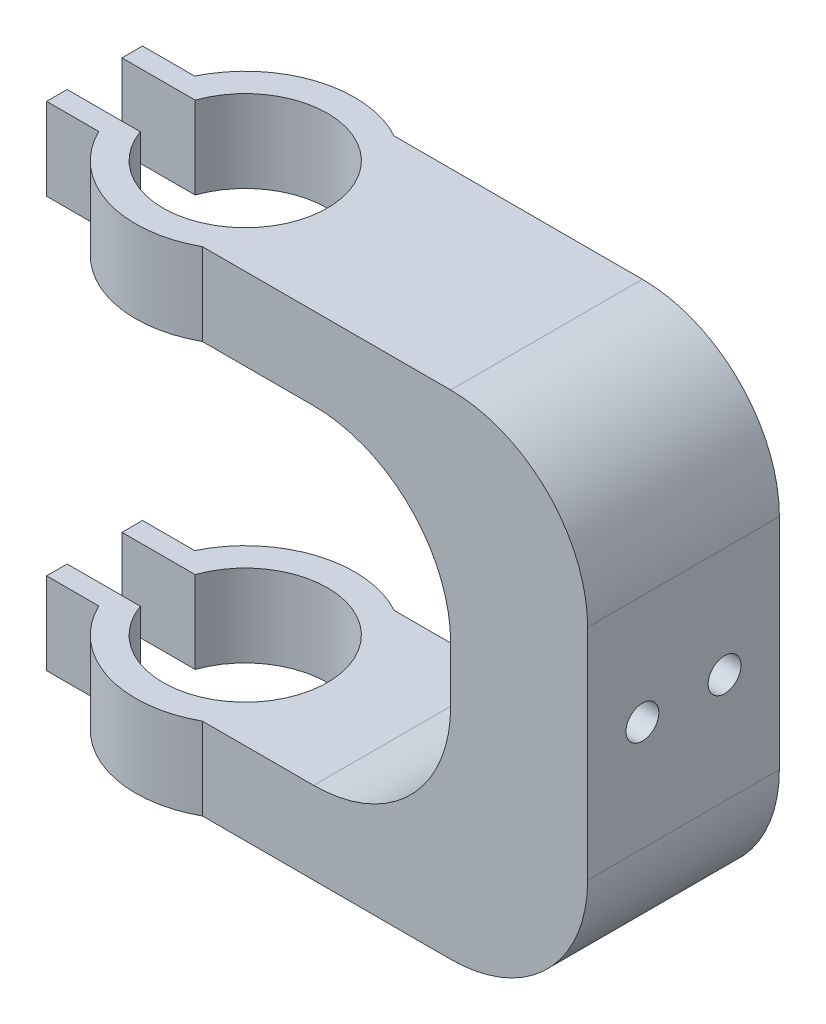
ISO-10303-21;
HEADER;
FILE_DESCRIPTION(('STEP AP214'),'2;1');
FILE_NAME('part.step','',(''),(''),'','','');
FILE_SCHEMA(('AUTOMOTIVE_DESIGN { 1 0 10303 214 1 1 1 1 }'));
ENDSEC;
DATA;
#1=APPLICATION_CONTEXT('core data for automotive mechanical design processes');
#2=APPLICATION_PROTOCOL_DEFINITION('international standard','automotive_design',2000,#1);
#3=PRODUCT_CONTEXT('',#1,'mechanical');
#4=PRODUCT('Part','Part','',(#3));
#5=PRODUCT_RELATED_PRODUCT_CATEGORY('part','',(#4));
#6=PRODUCT_DEFINITION_FORMATION('','',#4);
#7=PRODUCT_DEFINITION_CONTEXT('part definition',#1,'design');
#8=PRODUCT_DEFINITION('design','',#6,#7);
#9=PRODUCT_DEFINITION_SHAPE('','',#8);
#10=(LENGTH_UNIT() NAMED_UNIT(*) SI_UNIT(.MILLI.,.METRE.));
#11=(NAMED_UNIT(*) PLANE_ANGLE_UNIT() SI_UNIT($,.RADIAN.));
#12=(NAMED_UNIT(*) SI_UNIT($,.STERADIAN.) SOLID_ANGLE_UNIT());
#13=UNCERTAINTY_MEASURE_WITH_UNIT(LENGTH_MEASURE(1.E-05),#10,'distance_accuracy_value','');
#14=(GEOMETRIC_REPRESENTATION_CONTEXT(3) GLOBAL_UNCERTAINTY_ASSIGNED_CONTEXT((#13)) GLOBAL_UNIT_ASSIGNED_CONTEXT((#10,
#11,#12)) REPRESENTATION_CONTEXT('',''));
#15=CARTESIAN_POINT('',(0.,0.,0.));
#16=DIRECTION('',(0.,0.,1.));
#17=DIRECTION('',(1.,0.,0.));
#18=AXIS2_PLACEMENT_3D('',#15,#16,#17);
#19=CARTESIAN_POINT('',(-18.6807840209167,-9.,-1.));
#20=DIRECTION('',(0.,0.,-1.));
#21=DIRECTION('',(-1.,0.,0.));
#22=AXIS2_PLACEMENT_3D('',#19,#20,#21);
#23=PLANE('',#22);
#24=DIRECTION('',(0.,1.,0.));
#25=VECTOR('',#24,1.);
#26=CARTESIAN_POINT('',(-19.,-21.4197423483742,-1.));
#27=LINE('',#26,#25);
#28=CARTESIAN_POINT('',(-19.,6.,-1.));
#29=VERTEX_POINT('',#28);
#30=CARTESIAN_POINT('',(-19.,9.,-1.));
#31=VERTEX_POINT('',#30);
#32=EDGE_CURVE('E333',#29,#31,#27,.T.);
#33=ORIENTED_EDGE('',*,*,#32,.F.);
#34=DIRECTION('',(1.,0.,0.));
#35=VECTOR('',#34,1.);
#36=CARTESIAN_POINT('',(-18.6807840209167,6.,-1.));
#37=LINE('',#36,#35);
#38=CARTESIAN_POINT('',(-16.3284271247462,6.,-1.));
#39=VERTEX_POINT('',#38);
#40=EDGE_CURVE('E290',#29,#39,#37,.T.);
#41=ORIENTED_EDGE('',*,*,#40,.T.);
#42=DIRECTION('',(0.,1.,0.));
#43=VECTOR('',#42,1.);
#44=CARTESIAN_POINT('',(-16.3284271247462,-9.00000000000001,-1.));
#45=LINE('',#44,#43);
#46=CARTESIAN_POINT('',(-16.3284271247462,9.,-1.));
#47=VERTEX_POINT('',#46);
#48=EDGE_CURVE('E266',#39,#47,#45,.T.);
#49=ORIENTED_EDGE('',*,*,#48,.T.);
#50=DIRECTION('',(-1.,0.,0.));
#51=VECTOR('',#50,1.);
#52=CARTESIAN_POINT('',(-18.6807840209167,9.,-1.));
#53=LINE('',#52,#51);
#54=EDGE_CURVE('E351',#47,#31,#53,.T.);
#55=ORIENTED_EDGE('',*,*,#54,.T.);
#56=EDGE_LOOP('',(#33,#41,#49,#55));
#57=FACE_BOUND('',#56,.T.);
#58=ADVANCED_FACE('F42',(#57),#23,.F.);
#59=CARTESIAN_POINT('',(-13.5,-9.,0.));
#60=DIRECTION('',(0.,1.,0.));
#61=DIRECTION('',(-1.,0.,0.));
#62=AXIS2_PLACEMENT_3D('',#59,#60,#61);
#63=CYLINDRICAL_SURFACE('',#62,3.);
#64=CARTESIAN_POINT('',(-13.5,6.,0.));
#65=DIRECTION('',(0.,1.,0.));
#66=DIRECTION('',(0.,0.,1.));
#67=AXIS2_PLACEMENT_3D('',#64,#65,#66);
#68=CIRCLE('',#67,3.);
#69=CARTESIAN_POINT('',(-16.3284271247462,6.,1.));
#70=VERTEX_POINT('',#69);
#71=EDGE_CURVE('E304',#39,#70,#68,.F.);
#72=ORIENTED_EDGE('',*,*,#71,.T.);
#73=DIRECTION('',(0.,1.,0.));
#74=VECTOR('',#73,1.);
#75=CARTESIAN_POINT('',(-16.3284271247462,-9.00000000000001,1.));
#76=LINE('',#75,#74);
#77=CARTESIAN_POINT('',(-16.3284271247462,9.,1.));
#78=VERTEX_POINT('',#77);
#79=EDGE_CURVE('E269',#70,#78,#76,.T.);
#80=ORIENTED_EDGE('',*,*,#79,.T.);
#81=CARTESIAN_POINT('',(-13.5,9.,0.));
#82=DIRECTION('',(0.,1.,0.));
#83=DIRECTION('',(-1.,0.,0.));
#84=AXIS2_PLACEMENT_3D('',#81,#82,#83);
#85=CIRCLE('',#84,3.);
#86=EDGE_CURVE('E356',#78,#47,#85,.T.);
#87=ORIENTED_EDGE('',*,*,#86,.T.);
#88=ORIENTED_EDGE('',*,*,#48,.F.);
#89=EDGE_LOOP('',(#72,#80,#87,#88));
#90=FACE_BOUND('',#89,.T.);
#91=ADVANCED_FACE('F477',(#90),#63,.F.);
#92=CARTESIAN_POINT('',(-18.6807840209167,-9.,1.));
#93=DIRECTION('',(0.,0.,1.));
#94=DIRECTION('',(1.,0.,0.));
#95=AXIS2_PLACEMENT_3D('',#92,#93,#94);
#96=PLANE('',#95);
#97=DIRECTION('',(1.,0.,0.));
#98=VECTOR('',#97,1.);
#99=CARTESIAN_POINT('',(-18.6807840209167,9.,1.));
#100=LINE('',#99,#98);
#101=CARTESIAN_POINT('',(-19.,9.,1.));
#102=VERTEX_POINT('',#101);
#103=EDGE_CURVE('E354',#102,#78,#100,.T.);
#104=ORIENTED_EDGE('',*,*,#103,.T.);
#105=ORIENTED_EDGE('',*,*,#79,.F.);
#106=DIRECTION('',(-1.,0.,0.));
#107=VECTOR('',#106,1.);
#108=CARTESIAN_POINT('',(-18.6807840209167,6.,1.));
#109=LINE('',#108,#107);
#110=CARTESIAN_POINT('',(-19.,6.,1.));
#111=VERTEX_POINT('',#110);
#112=EDGE_CURVE('E287',#70,#111,#109,.T.);
#113=ORIENTED_EDGE('',*,*,#112,.T.);
#114=DIRECTION('',(0.,1.,0.));
#115=VECTOR('',#114,1.);
#116=CARTESIAN_POINT('',(-19.,-21.4197423483742,1.));
#117=LINE('',#116,#115);
#118=EDGE_CURVE('E330',#111,#102,#117,.T.);
#119=ORIENTED_EDGE('',*,*,#118,.T.);
#120=EDGE_LOOP('',(#104,#105,#113,#119));
#121=FACE_BOUND('',#120,.T.);
#122=ADVANCED_FACE('F480',(#121),#96,.F.);
#123=CARTESIAN_POINT('',(-17.0968736424845,-21.4197423483742,1.75));
#124=DIRECTION('',(0.,0.,1.));
#125=DIRECTION('',(1.,0.,0.));
#126=AXIS2_PLACEMENT_3D('',#123,#124,#125);
#127=PLANE('',#126);
#128=DIRECTION('',(-1.,0.,0.));
#129=VECTOR('',#128,1.);
#130=CARTESIAN_POINT('',(-17.0968736424845,6.,1.75));
#131=LINE('',#130,#129);
#132=CARTESIAN_POINT('',(-17.0968736424845,6.,1.75));
#133=VERTEX_POINT('',#132);
#134=CARTESIAN_POINT('',(-19.,6.,1.75));
#135=VERTEX_POINT('',#134);
#136=EDGE_CURVE('E299',#133,#135,#131,.T.);
#137=ORIENTED_EDGE('',*,*,#136,.F.);
#138=DIRECTION('',(0.,1.,0.));
#139=VECTOR('',#138,1.);
#140=CARTESIAN_POINT('',(-17.0968736424845,-9.00000000000001,1.75));
#141=LINE('',#140,#139);
#142=CARTESIAN_POINT('',(-17.0968736424845,9.,1.75));
#143=VERTEX_POINT('',#142);
#144=EDGE_CURVE('E262',#133,#143,#141,.T.);
#145=ORIENTED_EDGE('',*,*,#144,.T.);
#146=DIRECTION('',(1.,0.,0.));
#147=VECTOR('',#146,1.);
#148=CARTESIAN_POINT('',(-17.0968736424845,9.,1.75));
#149=LINE('',#148,#147);
#150=CARTESIAN_POINT('',(-19.,9.,1.75));
#151=VERTEX_POINT('',#150);
#152=EDGE_CURVE('E318',#151,#143,#149,.T.);
#153=ORIENTED_EDGE('',*,*,#152,.F.);
#154=DIRECTION('',(0.,1.,0.));
#155=VECTOR('',#154,1.);
#156=CARTESIAN_POINT('',(-19.,-21.4197423483742,1.75));
#157=LINE('',#156,#155);
#158=EDGE_CURVE('E340',#135,#151,#157,.T.);
#159=ORIENTED_EDGE('',*,*,#158,.F.);
#160=EDGE_LOOP('',(#137,#145,#153,#159));
#161=FACE_BOUND('',#160,.T.);
#162=ADVANCED_FACE('F491',(#161),#127,.T.);
#163=CARTESIAN_POINT('',(-17.0968736424845,-21.4197423483742,-1.75));
#164=DIRECTION('',(0.,0.,-1.));
#165=DIRECTION('',(-1.,0.,0.));
#166=AXIS2_PLACEMENT_3D('',#163,#164,#165);
#167=PLANE('',#166);
#168=DIRECTION('',(1.,0.,0.));
#169=VECTOR('',#168,1.);
#170=CARTESIAN_POINT('',(-17.0968736424845,6.,-1.75));
#171=LINE('',#170,#169);
#172=CARTESIAN_POINT('',(-19.,6.,-1.75));
#173=VERTEX_POINT('',#172);
#174=CARTESIAN_POINT('',(-17.0968736424845,6.,-1.75));
#175=VERTEX_POINT('',#174);
#176=EDGE_CURVE('E296',#173,#175,#171,.T.);
#177=ORIENTED_EDGE('',*,*,#176,.F.);
#178=DIRECTION('',(0.,1.,0.));
#179=VECTOR('',#178,1.);
#180=CARTESIAN_POINT('',(-19.,-21.4197423483742,-1.75));
#181=LINE('',#180,#179);
#182=CARTESIAN_POINT('',(-19.,9.,-1.75));
#183=VERTEX_POINT('',#182);
#184=EDGE_CURVE('E336',#173,#183,#181,.T.);
#185=ORIENTED_EDGE('',*,*,#184,.T.);
#186=DIRECTION('',(-1.,0.,0.));
#187=VECTOR('',#186,1.);
#188=CARTESIAN_POINT('',(-17.0968736424845,9.,-1.75));
#189=LINE('',#188,#187);
#190=CARTESIAN_POINT('',(-17.0968736424845,9.,-1.75));
#191=VERTEX_POINT('',#190);
#192=EDGE_CURVE('E324',#191,#183,#189,.T.);
#193=ORIENTED_EDGE('',*,*,#192,.F.);
#194=DIRECTION('',(0.,1.,0.));
#195=VECTOR('',#194,1.);
#196=CARTESIAN_POINT('',(-17.0968736424845,-9.00000000000001,-1.75));
#197=LINE('',#196,#195);
#198=EDGE_CURVE('E253',#175,#191,#197,.T.);
#199=ORIENTED_EDGE('',*,*,#198,.F.);
#200=EDGE_LOOP('',(#177,#185,#193,#199));
#201=FACE_BOUND('',#200,.T.);
#202=ADVANCED_FACE('F463',(#201),#167,.T.);
#203=CARTESIAN_POINT('',(-13.5,-21.4197423483742,0.));
#204=DIRECTION('',(0.,1.,0.));
#205=DIRECTION('',(-1.,0.,0.));
#206=AXIS2_PLACEMENT_3D('',#203,#204,#205);
#207=CYLINDRICAL_SURFACE('',#206,4.);
#208=CARTESIAN_POINT('',(-13.5,6.,0.));
#209=DIRECTION('',(0.,1.,0.));
#210=DIRECTION('',(0.,0.,1.));
#211=AXIS2_PLACEMENT_3D('',#208,#209,#210);
#212=CIRCLE('',#211,4.);
#213=CARTESIAN_POINT('',(-11.5635083268963,6.,-3.5));
#214=VERTEX_POINT('',#213);
#215=EDGE_CURVE('E301',#175,#214,#212,.F.);
#216=ORIENTED_EDGE('',*,*,#215,.F.);
#217=ORIENTED_EDGE('',*,*,#198,.T.);
#218=CARTESIAN_POINT('',(-13.5,9.,0.));
#219=DIRECTION('',(0.,1.,0.));
#220=DIRECTION('',(-1.,0.,0.));
#221=AXIS2_PLACEMENT_3D('',#218,#219,#220);
#222=CIRCLE('',#221,4.);
#223=CARTESIAN_POINT('',(-11.5635083268963,9.,-3.5));
#224=VERTEX_POINT('',#223);
#225=EDGE_CURVE('E321',#224,#191,#222,.T.);
#226=ORIENTED_EDGE('',*,*,#225,.F.);
#227=DIRECTION('',(0.,1.,0.));
#228=VECTOR('',#227,1.);
#229=CARTESIAN_POINT('',(-11.5635083268963,-21.4197423483742,-3.5));
#230=LINE('',#229,#228);
#231=EDGE_CURVE('E422',#224,#214,#230,.F.);
#232=ORIENTED_EDGE('',*,*,#231,.T.);
#233=EDGE_LOOP('',(#216,#217,#226,#232));
#234=FACE_BOUND('',#233,.T.);
#235=ADVANCED_FACE('F457',(#234),#207,.T.);
#236=CARTESIAN_POINT('',(-11.5635083268963,9.,3.5));
#237=VERTEX_POINT('',#236);
#238=EDGE_CURVE('E323',#143,#237,#222,.T.);
#239=ORIENTED_EDGE('',*,*,#238,.F.);
#240=ORIENTED_EDGE('',*,*,#144,.F.);
#241=CARTESIAN_POINT('',(-11.5635083268963,6.,3.5));
#242=VERTEX_POINT('',#241);
#243=EDGE_CURVE('E303',#242,#133,#212,.F.);
#244=ORIENTED_EDGE('',*,*,#243,.F.);
#245=DIRECTION('',(0.,1.,0.));
#246=VECTOR('',#245,1.);
#247=CARTESIAN_POINT('',(-11.5635083268963,-21.4197423483742,3.5));
#248=LINE('',#247,#246);
#249=EDGE_CURVE('E346',#237,#242,#248,.F.);
#250=ORIENTED_EDGE('',*,*,#249,.F.);
#251=EDGE_LOOP('',(#239,#240,#244,#250));
#252=FACE_BOUND('',#251,.T.);
#253=ADVANCED_FACE('F495',(#252),#207,.T.);
#254=CARTESIAN_POINT('',(-13.5,-6.,0.));
#255=DIRECTION('',(0.,-1.,0.));
#256=DIRECTION('',(1.,0.,0.));
#257=AXIS2_PLACEMENT_3D('',#254,#255,#256);
#258=CIRCLE('',#257,4.);
#259=CARTESIAN_POINT('',(-17.0968736424845,-6.,1.75));
#260=VERTEX_POINT('',#259);
#261=CARTESIAN_POINT('',(-11.5635083268963,-6.,3.5));
#262=VERTEX_POINT('',#261);
#263=EDGE_CURVE('E281',#260,#262,#258,.F.);
#264=ORIENTED_EDGE('',*,*,#263,.F.);
#265=CARTESIAN_POINT('',(-17.0968736424845,-9.00000000000001,1.75));
#266=VERTEX_POINT('',#265);
#267=EDGE_CURVE('E258',#266,#260,#141,.T.);
#268=ORIENTED_EDGE('',*,*,#267,.F.);
#269=CARTESIAN_POINT('',(-13.5,-9.,0.));
#270=DIRECTION('',(0.,1.,0.));
#271=DIRECTION('',(-1.,0.,0.));
#272=AXIS2_PLACEMENT_3D('',#269,#270,#271);
#273=CIRCLE('',#272,4.);
#274=CARTESIAN_POINT('',(-11.5635083268963,-9.,3.5));
#275=VERTEX_POINT('',#274);
#276=EDGE_CURVE('E247',#275,#266,#273,.F.);
#277=ORIENTED_EDGE('',*,*,#276,.F.);
#278=EDGE_CURVE('E315',#262,#275,#248,.F.);
#279=ORIENTED_EDGE('',*,*,#278,.F.);
#280=EDGE_LOOP('',(#264,#268,#277,#279));
#281=FACE_BOUND('',#280,.T.);
#282=ADVANCED_FACE('F528',(#281),#207,.T.);
#283=CARTESIAN_POINT('',(-19.,-21.4197423483742,1.));
#284=DIRECTION('',(-1.,0.,0.));
#285=DIRECTION('',(0.,-1.,0.));
#286=AXIS2_PLACEMENT_3D('',#283,#284,#285);
#287=PLANE('',#286);
#288=DIRECTION('',(0.,0.,-1.));
#289=VECTOR('',#288,1.);
#290=CARTESIAN_POINT('',(-19.,6.,1.));
#291=LINE('',#290,#289);
#292=EDGE_CURVE('E294',#135,#111,#291,.T.);
#293=ORIENTED_EDGE('',*,*,#292,.F.);
#294=ORIENTED_EDGE('',*,*,#158,.T.);
#295=DIRECTION('',(0.,0.,1.));
#296=VECTOR('',#295,1.);
#297=CARTESIAN_POINT('',(-19.,9.,1.));
#298=LINE('',#297,#296);
#299=EDGE_CURVE('E307',#102,#151,#298,.T.);
#300=ORIENTED_EDGE('',*,*,#299,.F.);
#301=ORIENTED_EDGE('',*,*,#118,.F.);
#302=EDGE_LOOP('',(#293,#294,#300,#301));
#303=FACE_BOUND('',#302,.T.);
#304=ADVANCED_FACE('F485',(#303),#287,.T.);
#305=CARTESIAN_POINT('',(-19.,-21.4197423483742,-1.));
#306=DIRECTION('',(-1.,0.,0.));
#307=DIRECTION('',(0.,-1.,0.));
#308=AXIS2_PLACEMENT_3D('',#305,#306,#307);
#309=PLANE('',#308);
#310=DIRECTION('',(0.,0.,-1.));
#311=VECTOR('',#310,1.);
#312=CARTESIAN_POINT('',(-19.,6.,-1.));
#313=LINE('',#312,#311);
#314=EDGE_CURVE('E292',#29,#173,#313,.T.);
#315=ORIENTED_EDGE('',*,*,#314,.F.);
#316=ORIENTED_EDGE('',*,*,#32,.T.);
#317=DIRECTION('',(0.,0.,1.));
#318=VECTOR('',#317,1.);
#319=CARTESIAN_POINT('',(-19.,9.,-1.));
#320=LINE('',#319,#318);
#321=EDGE_CURVE('E327',#183,#31,#320,.T.);
#322=ORIENTED_EDGE('',*,*,#321,.F.);
#323=ORIENTED_EDGE('',*,*,#184,.F.);
#324=EDGE_LOOP('',(#315,#316,#322,#323));
#325=FACE_BOUND('',#324,.T.);
#326=ADVANCED_FACE('F467',(#325),#309,.T.);
#327=CARTESIAN_POINT('',(2.5,9.,3.5));
#328=DIRECTION('',(-1.,0.,0.));
#329=DIRECTION('',(0.,0.,1.));
#330=AXIS2_PLACEMENT_3D('',#327,#328,#329);
#331=PLANE('',#330);
#332=CARTESIAN_POINT('',(2.5,0.,1.5));
#333=DIRECTION('',(-1.,0.,0.));
#334=DIRECTION('',(0.,0.,1.));
#335=AXIS2_PLACEMENT_3D('',#332,#333,#334);
#336=CIRCLE('',#335,0.6);
#337=CARTESIAN_POINT('',(2.5,0.,2.1));
#338=VERTEX_POINT('',#337);
#339=EDGE_CURVE('E361',#338,#338,#336,.T.);
#340=ORIENTED_EDGE('',*,*,#339,.T.);
#341=EDGE_LOOP('',(#340));
#342=FACE_BOUND('',#341,.T.);
#343=CARTESIAN_POINT('',(2.5,0.,-1.5));
#344=DIRECTION('',(-1.,0.,0.));
#345=DIRECTION('',(0.,0.,1.));
#346=AXIS2_PLACEMENT_3D('',#343,#344,#345);
#347=CIRCLE('',#346,0.6);
#348=CARTESIAN_POINT('',(2.5,0.,-0.9));
#349=VERTEX_POINT('',#348);
#350=EDGE_CURVE('E353',#349,#349,#347,.T.);
#351=ORIENTED_EDGE('',*,*,#350,.T.);
#352=EDGE_LOOP('',(#351));
#353=FACE_BOUND('',#352,.T.);
#354=DIRECTION('',(0.,1.,0.));
#355=VECTOR('',#354,1.);
#356=CARTESIAN_POINT('',(2.5,9.,3.5));
#357=LINE('',#356,#355);
#358=CARTESIAN_POINT('',(2.5,-4.,3.5));
#359=VERTEX_POINT('',#358);
#360=CARTESIAN_POINT('',(2.5,4.,3.5));
#361=VERTEX_POINT('',#360);
#362=EDGE_CURVE('E375',#359,#361,#357,.T.);
#363=ORIENTED_EDGE('',*,*,#362,.F.);
#364=DIRECTION('',(0.,0.,-1.));
#365=VECTOR('',#364,1.);
#366=CARTESIAN_POINT('',(2.5,-4.,3.5));
#367=LINE('',#366,#365);
#368=CARTESIAN_POINT('',(2.5,-4.,-3.5));
#369=VERTEX_POINT('',#368);
#370=EDGE_CURVE('E425',#359,#369,#367,.T.);
#371=ORIENTED_EDGE('',*,*,#370,.T.);
#372=DIRECTION('',(0.,1.,0.));
#373=VECTOR('',#372,1.);
#374=CARTESIAN_POINT('',(2.5,9.,-3.5));
#375=LINE('',#374,#373);
#376=CARTESIAN_POINT('',(2.5,4.,-3.5));
#377=VERTEX_POINT('',#376);
#378=EDGE_CURVE('E364',#369,#377,#375,.T.);
#379=ORIENTED_EDGE('',*,*,#378,.T.);
#380=DIRECTION('',(0.,0.,-1.));
#381=VECTOR('',#380,1.);
#382=CARTESIAN_POINT('',(2.5,4.,3.5));
#383=LINE('',#382,#381);
#384=EDGE_CURVE('E423',#377,#361,#383,.F.);
#385=ORIENTED_EDGE('',*,*,#384,.T.);
#386=EDGE_LOOP('',(#363,#371,#379,#385));
#387=FACE_BOUND('',#386,.T.);
#388=ADVANCED_FACE('F439',(#342,#353,#387),#331,.F.);
#389=CARTESIAN_POINT('',(2.5,9.,3.5));
#390=DIRECTION('',(0.,-1.,0.));
#391=DIRECTION('',(1.,0.,0.));
#392=AXIS2_PLACEMENT_3D('',#389,#390,#391);
#393=PLANE('',#392);
#394=DIRECTION('',(-1.,0.,0.));
#395=VECTOR('',#394,1.);
#396=CARTESIAN_POINT('',(2.5,9.,3.5));
#397=LINE('',#396,#395);
#398=CARTESIAN_POINT('',(-2.5,9.,3.5));
#399=VERTEX_POINT('',#398);
#400=EDGE_CURVE('E378',#399,#237,#397,.T.);
#401=ORIENTED_EDGE('',*,*,#400,.F.);
#402=DIRECTION('',(0.,0.,-1.));
#403=VECTOR('',#402,1.);
#404=CARTESIAN_POINT('',(-2.5,9.,3.5));
#405=LINE('',#404,#403);
#406=CARTESIAN_POINT('',(-2.5,9.,-3.5));
#407=VERTEX_POINT('',#406);
#408=EDGE_CURVE('E11',#399,#407,#405,.T.);
#409=ORIENTED_EDGE('',*,*,#408,.T.);
#410=DIRECTION('',(-1.,0.,0.));
#411=VECTOR('',#410,1.);
#412=CARTESIAN_POINT('',(2.5,9.,-3.5));
#413=LINE('',#412,#411);
#414=EDGE_CURVE('E394',#407,#224,#413,.T.);
#415=ORIENTED_EDGE('',*,*,#414,.T.);
#416=ORIENTED_EDGE('',*,*,#225,.T.);
#417=ORIENTED_EDGE('',*,*,#192,.T.);
#418=ORIENTED_EDGE('',*,*,#321,.T.);
#419=ORIENTED_EDGE('',*,*,#54,.F.);
#420=ORIENTED_EDGE('',*,*,#86,.F.);
#421=ORIENTED_EDGE('',*,*,#103,.F.);
#422=ORIENTED_EDGE('',*,*,#299,.T.);
#423=ORIENTED_EDGE('',*,*,#152,.T.);
#424=ORIENTED_EDGE('',*,*,#238,.T.);
#425=EDGE_LOOP('',(#401,#409,#415,#416,#417,#418,#419,#420,#421,#422,#423,#424));
#426=FACE_BOUND('',#425,.T.);
#427=ADVANCED_FACE('F449',(#426),#393,.F.);
#428=CARTESIAN_POINT('',(-7.5,6.,3.5));
#429=DIRECTION('',(0.,1.,0.));
#430=DIRECTION('',(-1.,0.,0.));
#431=AXIS2_PLACEMENT_3D('',#428,#429,#430);
#432=PLANE('',#431);
#433=ORIENTED_EDGE('',*,*,#176,.T.);
#434=ORIENTED_EDGE('',*,*,#215,.T.);
#435=DIRECTION('',(1.,0.,0.));
#436=VECTOR('',#435,1.);
#437=CARTESIAN_POINT('',(-7.5,6.,-3.5));
#438=LINE('',#437,#436);
#439=CARTESIAN_POINT('',(-7.5,6.,-3.5));
#440=VERTEX_POINT('',#439);
#441=EDGE_CURVE('E396',#214,#440,#438,.T.);
#442=ORIENTED_EDGE('',*,*,#441,.T.);
#443=DIRECTION('',(0.,0.,-1.));
#444=VECTOR('',#443,1.);
#445=CARTESIAN_POINT('',(-7.5,6.,3.5));
#446=LINE('',#445,#444);
#447=CARTESIAN_POINT('',(-7.5,6.,3.5));
#448=VERTEX_POINT('',#447);
#449=EDGE_CURVE('E416',#448,#440,#446,.T.);
#450=ORIENTED_EDGE('',*,*,#449,.F.);
#451=DIRECTION('',(1.,0.,0.));
#452=VECTOR('',#451,1.);
#453=CARTESIAN_POINT('',(-7.5,6.,3.5));
#454=LINE('',#453,#452);
#455=EDGE_CURVE('E380',#242,#448,#454,.T.);
#456=ORIENTED_EDGE('',*,*,#455,.F.);
#457=ORIENTED_EDGE('',*,*,#243,.T.);
#458=ORIENTED_EDGE('',*,*,#136,.T.);
#459=ORIENTED_EDGE('',*,*,#292,.T.);
#460=ORIENTED_EDGE('',*,*,#112,.F.);
#461=ORIENTED_EDGE('',*,*,#71,.F.);
#462=ORIENTED_EDGE('',*,*,#40,.F.);
#463=ORIENTED_EDGE('',*,*,#314,.T.);
#464=EDGE_LOOP('',(#433,#434,#442,#450,#456,#457,#458,#459,#460,#461,#462,#463));
#465=FACE_BOUND('',#464,.T.);
#466=ADVANCED_FACE('F500',(#465),#432,.F.);
#467=CARTESIAN_POINT('',(-7.5,1.,3.5));
#468=DIRECTION('',(0.,0.,-1.));
#469=DIRECTION('',(-1.,0.,0.));
#470=AXIS2_PLACEMENT_3D('',#467,#468,#469);
#471=CYLINDRICAL_SURFACE('',#470,5.);
#472=CARTESIAN_POINT('',(-7.5,1.,-3.5));
#473=DIRECTION('',(0.,0.,-1.));
#474=DIRECTION('',(1.,0.,0.));
#475=AXIS2_PLACEMENT_3D('',#472,#473,#474);
#476=CIRCLE('',#475,5.);
#477=CARTESIAN_POINT('',(-2.5,1.,-3.5));
#478=VERTEX_POINT('',#477);
#479=EDGE_CURVE('E398',#440,#478,#476,.T.);
#480=ORIENTED_EDGE('',*,*,#479,.T.);
#481=DIRECTION('',(0.,0.,-1.));
#482=VECTOR('',#481,1.);
#483=CARTESIAN_POINT('',(-2.5,1.,3.5));
#484=LINE('',#483,#482);
#485=CARTESIAN_POINT('',(-2.5,1.,3.5));
#486=VERTEX_POINT('',#485);
#487=EDGE_CURVE('E413',#486,#478,#484,.T.);
#488=ORIENTED_EDGE('',*,*,#487,.F.);
#489=CARTESIAN_POINT('',(-7.5,1.,3.5));
#490=DIRECTION('',(0.,0.,-1.));
#491=DIRECTION('',(1.,0.,0.));
#492=AXIS2_PLACEMENT_3D('',#489,#490,#491);
#493=CIRCLE('',#492,5.);
#494=EDGE_CURVE('E382',#448,#486,#493,.T.);
#495=ORIENTED_EDGE('',*,*,#494,.F.);
#496=ORIENTED_EDGE('',*,*,#449,.T.);
#497=EDGE_LOOP('',(#480,#488,#495,#496));
#498=FACE_BOUND('',#497,.T.);
#499=ADVANCED_FACE('F504',(#498),#471,.F.);
#500=CARTESIAN_POINT('',(-2.5,1.,3.5));
#501=DIRECTION('',(1.,0.,0.));
#502=DIRECTION('',(0.,0.,-1.));
#503=AXIS2_PLACEMENT_3D('',#500,#501,#502);
#504=PLANE('',#503);
#505=CARTESIAN_POINT('',(-2.5,0.,1.5));
#506=DIRECTION('',(-1.,0.,0.));
#507=DIRECTION('',(0.,0.,1.));
#508=AXIS2_PLACEMENT_3D('',#505,#506,#507);
#509=CIRCLE('',#508,0.6);
#510=CARTESIAN_POINT('',(-2.5,0.,2.1));
#511=VERTEX_POINT('',#510);
#512=EDGE_CURVE('E365',#511,#511,#509,.T.);
#513=ORIENTED_EDGE('',*,*,#512,.F.);
#514=EDGE_LOOP('',(#513));
#515=FACE_BOUND('',#514,.T.);
#516=CARTESIAN_POINT('',(-2.5,0.,-1.5));
#517=DIRECTION('',(-1.,0.,0.));
#518=DIRECTION('',(0.,0.,1.));
#519=AXIS2_PLACEMENT_3D('',#516,#517,#518);
#520=CIRCLE('',#519,0.6);
#521=CARTESIAN_POINT('',(-2.5,0.,-0.9));
#522=VERTEX_POINT('',#521);
#523=EDGE_CURVE('E368',#522,#522,#520,.T.);
#524=ORIENTED_EDGE('',*,*,#523,.F.);
#525=EDGE_LOOP('',(#524));
#526=FACE_BOUND('',#525,.T.);
#527=DIRECTION('',(0.,-1.,0.));
#528=VECTOR('',#527,1.);
#529=CARTESIAN_POINT('',(-2.5,1.,-3.5));
#530=LINE('',#529,#528);
#531=CARTESIAN_POINT('',(-2.5,-1.,-3.5));
#532=VERTEX_POINT('',#531);
#533=EDGE_CURVE('E400',#478,#532,#530,.T.);
#534=ORIENTED_EDGE('',*,*,#533,.T.);
#535=DIRECTION('',(0.,0.,-1.));
#536=VECTOR('',#535,1.);
#537=CARTESIAN_POINT('',(-2.5,-1.,3.5));
#538=LINE('',#537,#536);
#539=CARTESIAN_POINT('',(-2.5,-1.,3.5));
#540=VERTEX_POINT('',#539);
#541=EDGE_CURVE('E410',#540,#532,#538,.T.);
#542=ORIENTED_EDGE('',*,*,#541,.F.);
#543=DIRECTION('',(0.,-1.,0.));
#544=VECTOR('',#543,1.);
#545=CARTESIAN_POINT('',(-2.5,1.,3.5));
#546=LINE('',#545,#544);
#547=EDGE_CURVE('E384',#486,#540,#546,.T.);
#548=ORIENTED_EDGE('',*,*,#547,.F.);
#549=ORIENTED_EDGE('',*,*,#487,.T.);
#550=EDGE_LOOP('',(#534,#542,#548,#549));
#551=FACE_BOUND('',#550,.T.);
#552=ADVANCED_FACE('F510',(#515,#526,#551),#504,.F.);
#553=CARTESIAN_POINT('',(-7.5,-1.,3.5));
#554=DIRECTION('',(0.,0.,-1.));
#555=DIRECTION('',(-1.,0.,0.));
#556=AXIS2_PLACEMENT_3D('',#553,#554,#555);
#557=CYLINDRICAL_SURFACE('',#556,5.);
#558=CARTESIAN_POINT('',(-7.5,-1.,-3.5));
#559=DIRECTION('',(0.,0.,-1.));
#560=DIRECTION('',(-1.,0.,0.));
#561=AXIS2_PLACEMENT_3D('',#558,#559,#560);
#562=CIRCLE('',#561,5.);
#563=CARTESIAN_POINT('',(-7.5,-6.,-3.5));
#564=VERTEX_POINT('',#563);
#565=EDGE_CURVE('E402',#532,#564,#562,.T.);
#566=ORIENTED_EDGE('',*,*,#565,.T.);
#567=DIRECTION('',(0.,0.,-1.));
#568=VECTOR('',#567,1.);
#569=CARTESIAN_POINT('',(-7.5,-6.,3.5));
#570=LINE('',#569,#568);
#571=CARTESIAN_POINT('',(-7.5,-6.,3.5));
#572=VERTEX_POINT('',#571);
#573=EDGE_CURVE('E391',#572,#564,#570,.T.);
#574=ORIENTED_EDGE('',*,*,#573,.F.);
#575=CARTESIAN_POINT('',(-7.5,-1.,3.5));
#576=DIRECTION('',(0.,0.,-1.));
#577=DIRECTION('',(-1.,0.,0.));
#578=AXIS2_PLACEMENT_3D('',#575,#576,#577);
#579=CIRCLE('',#578,5.);
#580=EDGE_CURVE('E386',#540,#572,#579,.T.);
#581=ORIENTED_EDGE('',*,*,#580,.F.);
#582=ORIENTED_EDGE('',*,*,#541,.T.);
#583=EDGE_LOOP('',(#566,#574,#581,#582));
#584=FACE_BOUND('',#583,.T.);
#585=ADVANCED_FACE('F514',(#584),#557,.F.);
#586=CARTESIAN_POINT('',(-7.5,-6.,3.5));
#587=DIRECTION('',(0.,-1.,0.));
#588=DIRECTION('',(1.,0.,0.));
#589=AXIS2_PLACEMENT_3D('',#586,#587,#588);
#590=PLANE('',#589);
#591=CARTESIAN_POINT('',(-11.5635083268963,-6.,-3.5));
#592=VERTEX_POINT('',#591);
#593=CARTESIAN_POINT('',(-17.0968736424845,-6.,-1.75));
#594=VERTEX_POINT('',#593);
#595=EDGE_CURVE('E283',#592,#594,#258,.F.);
#596=ORIENTED_EDGE('',*,*,#595,.T.);
#597=DIRECTION('',(-1.,0.,0.));
#598=VECTOR('',#597,1.);
#599=CARTESIAN_POINT('',(-17.0968736424845,-6.,-1.75));
#600=LINE('',#599,#598);
#601=CARTESIAN_POINT('',(-19.,-6.,-1.75));
#602=VERTEX_POINT('',#601);
#603=EDGE_CURVE('E250',#594,#602,#600,.T.);
#604=ORIENTED_EDGE('',*,*,#603,.T.);
#605=DIRECTION('',(0.,0.,1.));
#606=VECTOR('',#605,1.);
#607=CARTESIAN_POINT('',(-19.,-6.,-1.));
#608=LINE('',#607,#606);
#609=CARTESIAN_POINT('',(-19.,-6.,-1.));
#610=VERTEX_POINT('',#609);
#611=EDGE_CURVE('E273',#602,#610,#608,.T.);
#612=ORIENTED_EDGE('',*,*,#611,.T.);
#613=DIRECTION('',(-1.,0.,0.));
#614=VECTOR('',#613,1.);
#615=CARTESIAN_POINT('',(-18.6807840209167,-6.,-1.));
#616=LINE('',#615,#614);
#617=CARTESIAN_POINT('',(-16.3284271247462,-6.,-1.));
#618=VERTEX_POINT('',#617);
#619=EDGE_CURVE('E255',#618,#610,#616,.T.);
#620=ORIENTED_EDGE('',*,*,#619,.F.);
#621=CARTESIAN_POINT('',(-13.5,-6.,0.));
#622=DIRECTION('',(0.,-1.,0.));
#623=DIRECTION('',(1.,0.,0.));
#624=AXIS2_PLACEMENT_3D('',#621,#622,#623);
#625=CIRCLE('',#624,3.);
#626=CARTESIAN_POINT('',(-16.3284271247462,-6.,1.));
#627=VERTEX_POINT('',#626);
#628=EDGE_CURVE('E284',#627,#618,#625,.F.);
#629=ORIENTED_EDGE('',*,*,#628,.F.);
#630=DIRECTION('',(1.,0.,0.));
#631=VECTOR('',#630,1.);
#632=CARTESIAN_POINT('',(-18.6807840209167,-6.,1.));
#633=LINE('',#632,#631);
#634=CARTESIAN_POINT('',(-19.,-6.,1.));
#635=VERTEX_POINT('',#634);
#636=EDGE_CURVE('E252',#635,#627,#633,.T.);
#637=ORIENTED_EDGE('',*,*,#636,.F.);
#638=DIRECTION('',(0.,0.,1.));
#639=VECTOR('',#638,1.);
#640=CARTESIAN_POINT('',(-19.,-6.,1.));
#641=LINE('',#640,#639);
#642=CARTESIAN_POINT('',(-19.,-6.,1.75));
#643=VERTEX_POINT('',#642);
#644=EDGE_CURVE('E275',#635,#643,#641,.T.);
#645=ORIENTED_EDGE('',*,*,#644,.T.);
#646=DIRECTION('',(1.,0.,0.));
#647=VECTOR('',#646,1.);
#648=CARTESIAN_POINT('',(-17.0968736424845,-6.,1.75));
#649=LINE('',#648,#647);
#650=EDGE_CURVE('E278',#643,#260,#649,.T.);
#651=ORIENTED_EDGE('',*,*,#650,.T.);
#652=ORIENTED_EDGE('',*,*,#263,.T.);
#653=DIRECTION('',(-1.,0.,0.));
#654=VECTOR('',#653,1.);
#655=CARTESIAN_POINT('',(-7.5,-6.,3.5));
#656=LINE('',#655,#654);
#657=EDGE_CURVE('E388',#572,#262,#656,.T.);
#658=ORIENTED_EDGE('',*,*,#657,.F.);
#659=ORIENTED_EDGE('',*,*,#573,.T.);
#660=DIRECTION('',(-1.,0.,0.));
#661=VECTOR('',#660,1.);
#662=CARTESIAN_POINT('',(-7.5,-6.,-3.5));
#663=LINE('',#662,#661);
#664=EDGE_CURVE('E404',#564,#592,#663,.T.);
#665=ORIENTED_EDGE('',*,*,#664,.T.);
#666=EDGE_LOOP('',(#596,#604,#612,#620,#629,#637,#645,#651,#652,#658,#659,#665));
#667=FACE_BOUND('',#666,.T.);
#668=ADVANCED_FACE('F518',(#667),#590,.F.);
#669=CARTESIAN_POINT('',(-4.57609893156715,-9.,3.5));
#670=DIRECTION('',(0.,1.,0.));
#671=DIRECTION('',(-1.,0.,0.));
#672=AXIS2_PLACEMENT_3D('',#669,#670,#671);
#673=PLANE('',#672);
#674=DIRECTION('',(1.,0.,0.));
#675=VECTOR('',#674,1.);
#676=CARTESIAN_POINT('',(-4.57609893156715,-9.,-3.5));
#677=LINE('',#676,#675);
#678=CARTESIAN_POINT('',(-11.5635083268963,-9.,-3.5));
#679=VERTEX_POINT('',#678);
#680=CARTESIAN_POINT('',(-2.5,-9.,-3.5));
#681=VERTEX_POINT('',#680);
#682=EDGE_CURVE('E376',#679,#681,#677,.T.);
#683=ORIENTED_EDGE('',*,*,#682,.T.);
#684=DIRECTION('',(0.,0.,-1.));
#685=VECTOR('',#684,1.);
#686=CARTESIAN_POINT('',(-2.5,-9.,3.5));
#687=LINE('',#686,#685);
#688=CARTESIAN_POINT('',(-2.49999999999999,-9.,3.5));
#689=VERTEX_POINT('',#688);
#690=EDGE_CURVE('E65',#681,#689,#687,.F.);
#691=ORIENTED_EDGE('',*,*,#690,.T.);
#692=DIRECTION('',(1.,0.,0.));
#693=VECTOR('',#692,1.);
#694=CARTESIAN_POINT('',(2.5,-9.,3.5));
#695=LINE('',#694,#693);
#696=EDGE_CURVE('E373',#275,#689,#695,.T.);
#697=ORIENTED_EDGE('',*,*,#696,.F.);
#698=ORIENTED_EDGE('',*,*,#276,.T.);
#699=DIRECTION('',(-1.,0.,0.));
#700=VECTOR('',#699,1.);
#701=CARTESIAN_POINT('',(-17.0968736424845,-9.,1.75));
#702=LINE('',#701,#700);
#703=CARTESIAN_POINT('',(-19.,-9.,1.75));
#704=VERTEX_POINT('',#703);
#705=EDGE_CURVE('E311',#266,#704,#702,.T.);
#706=ORIENTED_EDGE('',*,*,#705,.T.);
#707=DIRECTION('',(0.,0.,-1.));
#708=VECTOR('',#707,1.);
#709=CARTESIAN_POINT('',(-19.,-9.,1.));
#710=LINE('',#709,#708);
#711=CARTESIAN_POINT('',(-19.,-9.00000000000001,1.));
#712=VERTEX_POINT('',#711);
#713=EDGE_CURVE('E308',#704,#712,#710,.T.);
#714=ORIENTED_EDGE('',*,*,#713,.T.);
#715=DIRECTION('',(1.,0.,0.));
#716=VECTOR('',#715,1.);
#717=CARTESIAN_POINT('',(-4.57609893156715,-9.,1.));
#718=LINE('',#717,#716);
#719=CARTESIAN_POINT('',(-16.3284271247462,-9.00000000000001,1.));
#720=VERTEX_POINT('',#719);
#721=EDGE_CURVE('E419',#712,#720,#718,.T.);
#722=ORIENTED_EDGE('',*,*,#721,.T.);
#723=CARTESIAN_POINT('',(-13.5,-9.,0.));
#724=DIRECTION('',(0.,1.,0.));
#725=DIRECTION('',(-1.,0.,0.));
#726=AXIS2_PLACEMENT_3D('',#723,#724,#725);
#727=CIRCLE('',#726,3.);
#728=CARTESIAN_POINT('',(-16.3284271247462,-9.00000000000001,-1.));
#729=VERTEX_POINT('',#728);
#730=EDGE_CURVE('E347',#720,#729,#727,.T.);
#731=ORIENTED_EDGE('',*,*,#730,.T.);
#732=DIRECTION('',(-1.,0.,0.));
#733=VECTOR('',#732,1.);
#734=CARTESIAN_POINT('',(-18.6807840209167,-9.,-1.));
#735=LINE('',#734,#733);
#736=CARTESIAN_POINT('',(-19.,-9.,-1.));
#737=VERTEX_POINT('',#736);
#738=EDGE_CURVE('E350',#729,#737,#735,.T.);
#739=ORIENTED_EDGE('',*,*,#738,.T.);
#740=DIRECTION('',(0.,0.,-1.));
#741=VECTOR('',#740,1.);
#742=CARTESIAN_POINT('',(-19.,-9.,-1.));
#743=LINE('',#742,#741);
#744=CARTESIAN_POINT('',(-19.,-9.,-1.75));
#745=VERTEX_POINT('',#744);
#746=EDGE_CURVE('E235',#737,#745,#743,.T.);
#747=ORIENTED_EDGE('',*,*,#746,.T.);
#748=DIRECTION('',(1.,0.,0.));
#749=VECTOR('',#748,1.);
#750=CARTESIAN_POINT('',(-17.0968736424845,-9.,-1.75));
#751=LINE('',#750,#749);
#752=CARTESIAN_POINT('',(-17.0968736424845,-9.00000000000001,-1.75));
#753=VERTEX_POINT('',#752);
#754=EDGE_CURVE('E229',#745,#753,#751,.T.);
#755=ORIENTED_EDGE('',*,*,#754,.T.);
#756=EDGE_CURVE('E232',#753,#679,#273,.F.);
#757=ORIENTED_EDGE('',*,*,#756,.T.);
#758=EDGE_LOOP('',(#683,#691,#697,#698,#706,#714,#722,#731,#739,#747,#755,#757));
#759=FACE_BOUND('',#758,.T.);
#760=ADVANCED_FACE('F231',(#759),#673,.F.);
#761=CARTESIAN_POINT('',(-7.5,-1.,3.5));
#762=DIRECTION('',(0.,0.,-1.));
#763=DIRECTION('',(-1.,0.,0.));
#764=AXIS2_PLACEMENT_3D('',#761,#762,#763);
#765=PLANE('',#764);
#766=ORIENTED_EDGE('',*,*,#696,.T.);
#767=CARTESIAN_POINT('',(-2.5,-4.,3.5));
#768=DIRECTION('',(0.,0.,-1.));
#769=DIRECTION('',(-1.,0.,0.));
#770=AXIS2_PLACEMENT_3D('',#767,#768,#769);
#771=CIRCLE('',#770,5.);
#772=EDGE_CURVE('E50',#689,#359,#771,.F.);
#773=ORIENTED_EDGE('',*,*,#772,.T.);
#774=ORIENTED_EDGE('',*,*,#362,.T.);
#775=CARTESIAN_POINT('',(-2.5,4.,3.5));
#776=DIRECTION('',(0.,0.,-1.));
#777=DIRECTION('',(-1.,0.,0.));
#778=AXIS2_PLACEMENT_3D('',#775,#776,#777);
#779=CIRCLE('',#778,5.);
#780=EDGE_CURVE('E57',#361,#399,#779,.F.);
#781=ORIENTED_EDGE('',*,*,#780,.T.);
#782=ORIENTED_EDGE('',*,*,#400,.T.);
#783=ORIENTED_EDGE('',*,*,#249,.T.);
#784=ORIENTED_EDGE('',*,*,#455,.T.);
#785=ORIENTED_EDGE('',*,*,#494,.T.);
#786=ORIENTED_EDGE('',*,*,#547,.T.);
#787=ORIENTED_EDGE('',*,*,#580,.T.);
#788=ORIENTED_EDGE('',*,*,#657,.T.);
#789=ORIENTED_EDGE('',*,*,#278,.T.);
#790=EDGE_LOOP('',(#766,#773,#774,#781,#782,#783,#784,#785,#786,#787,#788,#789));
#791=FACE_BOUND('',#790,.T.);
#792=ADVANCED_FACE('F435',(#791),#765,.F.);
#793=CARTESIAN_POINT('',(-7.5,-1.,-3.5));
#794=DIRECTION('',(0.,0.,-1.));
#795=DIRECTION('',(-1.,0.,0.));
#796=AXIS2_PLACEMENT_3D('',#793,#794,#795);
#797=PLANE('',#796);
#798=ORIENTED_EDGE('',*,*,#378,.F.);
#799=CARTESIAN_POINT('',(-2.5,-4.,-3.5));
#800=DIRECTION('',(0.,0.,-1.));
#801=DIRECTION('',(-1.,0.,0.));
#802=AXIS2_PLACEMENT_3D('',#799,#800,#801);
#803=CIRCLE('',#802,5.);
#804=EDGE_CURVE('E430',#369,#681,#803,.T.);
#805=ORIENTED_EDGE('',*,*,#804,.T.);
#806=ORIENTED_EDGE('',*,*,#682,.F.);
#807=EDGE_CURVE('E246',#592,#679,#230,.F.);
#808=ORIENTED_EDGE('',*,*,#807,.F.);
#809=ORIENTED_EDGE('',*,*,#664,.F.);
#810=ORIENTED_EDGE('',*,*,#565,.F.);
#811=ORIENTED_EDGE('',*,*,#533,.F.);
#812=ORIENTED_EDGE('',*,*,#479,.F.);
#813=ORIENTED_EDGE('',*,*,#441,.F.);
#814=ORIENTED_EDGE('',*,*,#231,.F.);
#815=ORIENTED_EDGE('',*,*,#414,.F.);
#816=CARTESIAN_POINT('',(-2.5,4.,-3.5));
#817=DIRECTION('',(0.,0.,-1.));
#818=DIRECTION('',(-1.,0.,0.));
#819=AXIS2_PLACEMENT_3D('',#816,#817,#818);
#820=CIRCLE('',#819,5.);
#821=EDGE_CURVE('E428',#407,#377,#820,.T.);
#822=ORIENTED_EDGE('',*,*,#821,.T.);
#823=EDGE_LOOP('',(#798,#805,#806,#808,#809,#810,#811,#812,#813,#814,#815,#822));
#824=FACE_BOUND('',#823,.T.);
#825=ADVANCED_FACE('F444',(#824),#797,.T.);
#826=CARTESIAN_POINT('',(2.5,0.,-1.5));
#827=DIRECTION('',(-1.,0.,0.));
#828=DIRECTION('',(0.,0.,1.));
#829=AXIS2_PLACEMENT_3D('',#826,#827,#828);
#830=CYLINDRICAL_SURFACE('',#829,0.6);
#831=ORIENTED_EDGE('',*,*,#350,.F.);
#832=EDGE_LOOP('',(#831));
#833=FACE_BOUND('',#832,.T.);
#834=ORIENTED_EDGE('',*,*,#523,.T.);
#835=EDGE_LOOP('',(#834));
#836=FACE_BOUND('',#835,.T.);
#837=ADVANCED_FACE('F568',(#833,#836),#830,.F.);
#838=CARTESIAN_POINT('',(2.5,0.,1.5));
#839=DIRECTION('',(-1.,0.,0.));
#840=DIRECTION('',(0.,0.,1.));
#841=AXIS2_PLACEMENT_3D('',#838,#839,#840);
#842=CYLINDRICAL_SURFACE('',#841,0.6);
#843=ORIENTED_EDGE('',*,*,#339,.F.);
#844=EDGE_LOOP('',(#843));
#845=FACE_BOUND('',#844,.T.);
#846=ORIENTED_EDGE('',*,*,#512,.T.);
#847=EDGE_LOOP('',(#846));
#848=FACE_BOUND('',#847,.T.);
#849=ADVANCED_FACE('F563',(#845,#848),#842,.F.);
#850=ORIENTED_EDGE('',*,*,#738,.F.);
#851=EDGE_CURVE('E263',#729,#618,#45,.T.);
#852=ORIENTED_EDGE('',*,*,#851,.T.);
#853=ORIENTED_EDGE('',*,*,#619,.T.);
#854=EDGE_CURVE('E312',#737,#610,#27,.T.);
#855=ORIENTED_EDGE('',*,*,#854,.F.);
#856=EDGE_LOOP('',(#850,#852,#853,#855));
#857=FACE_BOUND('',#856,.T.);
#858=ADVANCED_FACE('F542',(#857),#23,.F.);
#859=ORIENTED_EDGE('',*,*,#730,.F.);
#860=EDGE_CURVE('E267',#720,#627,#76,.T.);
#861=ORIENTED_EDGE('',*,*,#860,.T.);
#862=ORIENTED_EDGE('',*,*,#628,.T.);
#863=ORIENTED_EDGE('',*,*,#851,.F.);
#864=EDGE_LOOP('',(#859,#861,#862,#863));
#865=FACE_BOUND('',#864,.T.);
#866=ADVANCED_FACE('F540',(#865),#63,.F.);
#867=EDGE_CURVE('E341',#712,#635,#117,.T.);
#868=ORIENTED_EDGE('',*,*,#867,.T.);
#869=ORIENTED_EDGE('',*,*,#636,.T.);
#870=ORIENTED_EDGE('',*,*,#860,.F.);
#871=ORIENTED_EDGE('',*,*,#721,.F.);
#872=EDGE_LOOP('',(#868,#869,#870,#871));
#873=FACE_BOUND('',#872,.T.);
#874=ADVANCED_FACE('F536',(#873),#96,.F.);
#875=ORIENTED_EDGE('',*,*,#650,.F.);
#876=EDGE_CURVE('E337',#704,#643,#157,.T.);
#877=ORIENTED_EDGE('',*,*,#876,.F.);
#878=ORIENTED_EDGE('',*,*,#705,.F.);
#879=ORIENTED_EDGE('',*,*,#267,.T.);
#880=EDGE_LOOP('',(#875,#877,#878,#879));
#881=FACE_BOUND('',#880,.T.);
#882=ADVANCED_FACE('F527',(#881),#127,.T.);
#883=ORIENTED_EDGE('',*,*,#603,.F.);
#884=EDGE_CURVE('E244',#753,#594,#197,.T.);
#885=ORIENTED_EDGE('',*,*,#884,.F.);
#886=ORIENTED_EDGE('',*,*,#754,.F.);
#887=EDGE_CURVE('E334',#745,#602,#181,.T.);
#888=ORIENTED_EDGE('',*,*,#887,.T.);
#889=EDGE_LOOP('',(#883,#885,#886,#888));
#890=FACE_BOUND('',#889,.T.);
#891=ADVANCED_FACE('F249',(#890),#167,.T.);
#892=ORIENTED_EDGE('',*,*,#595,.F.);
#893=ORIENTED_EDGE('',*,*,#807,.T.);
#894=ORIENTED_EDGE('',*,*,#756,.F.);
#895=ORIENTED_EDGE('',*,*,#884,.T.);
#896=EDGE_LOOP('',(#892,#893,#894,#895));
#897=FACE_BOUND('',#896,.T.);
#898=ADVANCED_FACE('F243',(#897),#207,.T.);
#899=ORIENTED_EDGE('',*,*,#644,.F.);
#900=ORIENTED_EDGE('',*,*,#867,.F.);
#901=ORIENTED_EDGE('',*,*,#713,.F.);
#902=ORIENTED_EDGE('',*,*,#876,.T.);
#903=EDGE_LOOP('',(#899,#900,#901,#902));
#904=FACE_BOUND('',#903,.T.);
#905=ADVANCED_FACE('F531',(#904),#287,.T.);
#906=ORIENTED_EDGE('',*,*,#611,.F.);
#907=ORIENTED_EDGE('',*,*,#887,.F.);
#908=ORIENTED_EDGE('',*,*,#746,.F.);
#909=ORIENTED_EDGE('',*,*,#854,.T.);
#910=EDGE_LOOP('',(#906,#907,#908,#909));
#911=FACE_BOUND('',#910,.T.);
#912=ADVANCED_FACE('F546',(#911),#309,.T.);
#913=CARTESIAN_POINT('',(-2.5,-4.,3.5));
#914=DIRECTION('',(0.,0.,-1.));
#915=DIRECTION('',(-1.,0.,0.));
#916=AXIS2_PLACEMENT_3D('',#913,#914,#915);
#917=CYLINDRICAL_SURFACE('',#916,5.);
#918=ORIENTED_EDGE('',*,*,#772,.F.);
#919=ORIENTED_EDGE('',*,*,#690,.F.);
#920=ORIENTED_EDGE('',*,*,#804,.F.);
#921=ORIENTED_EDGE('',*,*,#370,.F.);
#922=EDGE_LOOP('',(#918,#919,#920,#921));
#923=FACE_BOUND('',#922,.T.);
#924=ADVANCED_FACE('F442',(#923),#917,.T.);
#925=CARTESIAN_POINT('',(-2.5,4.,3.5));
#926=DIRECTION('',(0.,0.,-1.));
#927=DIRECTION('',(-1.,0.,0.));
#928=AXIS2_PLACEMENT_3D('',#925,#926,#927);
#929=CYLINDRICAL_SURFACE('',#928,5.);
#930=ORIENTED_EDGE('',*,*,#780,.F.);
#931=ORIENTED_EDGE('',*,*,#384,.F.);
#932=ORIENTED_EDGE('',*,*,#821,.F.);
#933=ORIENTED_EDGE('',*,*,#408,.F.);
#934=EDGE_LOOP('',(#930,#931,#932,#933));
#935=FACE_BOUND('',#934,.T.);
#936=ADVANCED_FACE('F44',(#935),#929,.T.);
#937=CLOSED_SHELL('',(#58,#91,#122,#162,#202,#235,#253,#282,#304,#326,#388,#427,#466,#499,#552,
#585,#668,#760,#792,#825,#837,#849,#858,#866,#874,#882,#891,#898,#905,#912,#924,#936));
#938=MANIFOLD_SOLID_BREP('B2',#937);
#939=ADVANCED_BREP_SHAPE_REPRESENTATION('',(#18,#938),#14);
#940=SHAPE_DEFINITION_REPRESENTATION(#9,#939);
ENDSEC;
END-ISO-10303-21;
